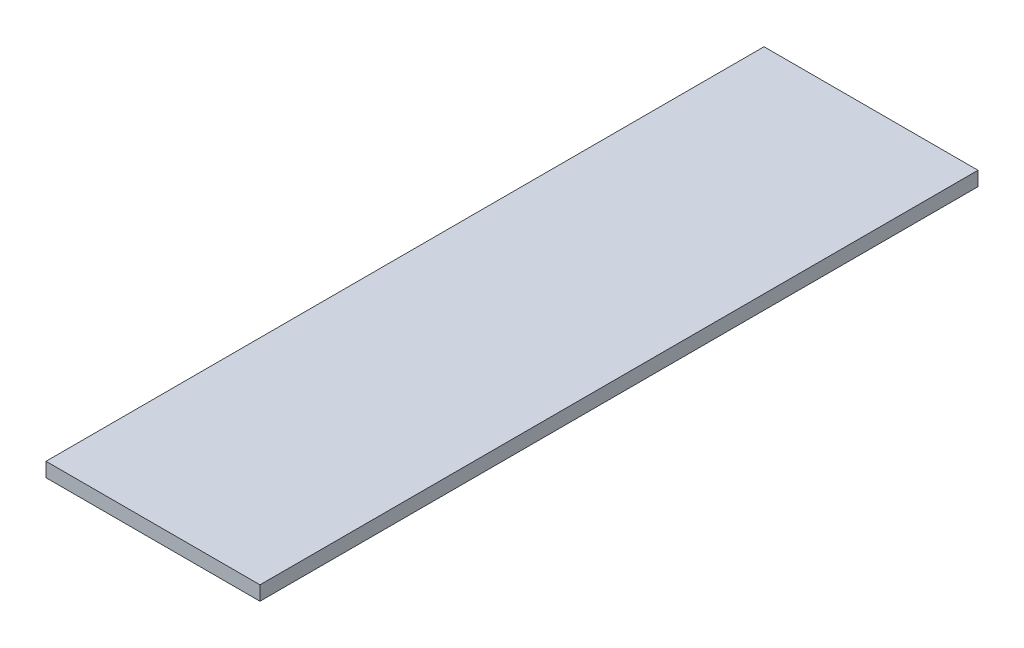
ISO-10303-21;
HEADER;
FILE_DESCRIPTION(('STEP AP214'),'2;1');
FILE_NAME('part.step','',(''),(''),'','','');
FILE_SCHEMA(('AUTOMOTIVE_DESIGN { 1 0 10303 214 1 1 1 1 }'));
ENDSEC;
DATA;
#1=APPLICATION_CONTEXT('core data for automotive mechanical design processes');
#2=APPLICATION_PROTOCOL_DEFINITION('international standard','automotive_design',2000,#1);
#3=PRODUCT_CONTEXT('',#1,'mechanical');
#4=PRODUCT('Part','Part','',(#3));
#5=PRODUCT_RELATED_PRODUCT_CATEGORY('part','',(#4));
#6=PRODUCT_DEFINITION_FORMATION('','',#4);
#7=PRODUCT_DEFINITION_CONTEXT('part definition',#1,'design');
#8=PRODUCT_DEFINITION('design','',#6,#7);
#9=PRODUCT_DEFINITION_SHAPE('','',#8);
#10=(LENGTH_UNIT() NAMED_UNIT(*) SI_UNIT(.MILLI.,.METRE.));
#11=(NAMED_UNIT(*) PLANE_ANGLE_UNIT() SI_UNIT($,.RADIAN.));
#12=(NAMED_UNIT(*) SI_UNIT($,.STERADIAN.) SOLID_ANGLE_UNIT());
#13=UNCERTAINTY_MEASURE_WITH_UNIT(LENGTH_MEASURE(1.E-05),#10,'distance_accuracy_value','');
#14=(GEOMETRIC_REPRESENTATION_CONTEXT(3) GLOBAL_UNCERTAINTY_ASSIGNED_CONTEXT((#13)) GLOBAL_UNIT_ASSIGNED_CONTEXT((#10,
#11,#12)) REPRESENTATION_CONTEXT('',''));
#15=CARTESIAN_POINT('',(0.,0.,0.));
#16=DIRECTION('',(0.,0.,1.));
#17=DIRECTION('',(1.,0.,0.));
#18=AXIS2_PLACEMENT_3D('',#15,#16,#17);
#19=CARTESIAN_POINT('',(225.,-15.,-755.));
#20=DIRECTION('',(0.,0.,1.));
#21=DIRECTION('',(1.,0.,0.));
#22=AXIS2_PLACEMENT_3D('',#19,#20,#21);
#23=PLANE('',#22);
#24=DIRECTION('',(0.,1.,0.));
#25=VECTOR('',#24,1.);
#26=CARTESIAN_POINT('',(-225.,-15.,-755.));
#27=LINE('',#26,#25);
#28=CARTESIAN_POINT('',(-225.,-15.,-755.));
#29=VERTEX_POINT('',#28);
#30=CARTESIAN_POINT('',(-225.,15.,-755.));
#31=VERTEX_POINT('',#30);
#32=EDGE_CURVE('E102',#29,#31,#27,.T.);
#33=ORIENTED_EDGE('',*,*,#32,.T.);
#34=DIRECTION('',(-1.,0.,0.));
#35=VECTOR('',#34,1.);
#36=CARTESIAN_POINT('',(225.,15.,-755.));
#37=LINE('',#36,#35);
#38=CARTESIAN_POINT('',(225.,15.,-755.));
#39=VERTEX_POINT('',#38);
#40=EDGE_CURVE('E11',#39,#31,#37,.T.);
#41=ORIENTED_EDGE('',*,*,#40,.F.);
#42=DIRECTION('',(0.,1.,0.));
#43=VECTOR('',#42,1.);
#44=CARTESIAN_POINT('',(225.,-15.,-755.));
#45=LINE('',#44,#43);
#46=CARTESIAN_POINT('',(225.,-15.,-755.));
#47=VERTEX_POINT('',#46);
#48=EDGE_CURVE('E90',#47,#39,#45,.T.);
#49=ORIENTED_EDGE('',*,*,#48,.F.);
#50=DIRECTION('',(-1.,0.,0.));
#51=VECTOR('',#50,1.);
#52=CARTESIAN_POINT('',(225.,-15.,-755.));
#53=LINE('',#52,#51);
#54=EDGE_CURVE('E98',#47,#29,#53,.T.);
#55=ORIENTED_EDGE('',*,*,#54,.T.);
#56=EDGE_LOOP('',(#33,#41,#49,#55));
#57=FACE_BOUND('',#56,.T.);
#58=ADVANCED_FACE('F39',(#57),#23,.F.);
#59=CARTESIAN_POINT('',(225.,15.,755.));
#60=DIRECTION('',(0.,-1.,0.));
#61=DIRECTION('',(0.,0.,-1.));
#62=AXIS2_PLACEMENT_3D('',#59,#60,#61);
#63=PLANE('',#62);
#64=DIRECTION('',(0.,0.,1.));
#65=VECTOR('',#64,1.);
#66=CARTESIAN_POINT('',(-225.,15.,755.));
#67=LINE('',#66,#65);
#68=CARTESIAN_POINT('',(-225.,15.,755.));
#69=VERTEX_POINT('',#68);
#70=EDGE_CURVE('E94',#31,#69,#67,.T.);
#71=ORIENTED_EDGE('',*,*,#70,.T.);
#72=DIRECTION('',(-1.,0.,0.));
#73=VECTOR('',#72,1.);
#74=CARTESIAN_POINT('',(225.,15.,755.));
#75=LINE('',#74,#73);
#76=CARTESIAN_POINT('',(225.,15.,755.));
#77=VERTEX_POINT('',#76);
#78=EDGE_CURVE('E47',#77,#69,#75,.T.);
#79=ORIENTED_EDGE('',*,*,#78,.F.);
#80=DIRECTION('',(0.,0.,1.));
#81=VECTOR('',#80,1.);
#82=CARTESIAN_POINT('',(225.,15.,755.));
#83=LINE('',#82,#81);
#84=EDGE_CURVE('E85',#39,#77,#83,.T.);
#85=ORIENTED_EDGE('',*,*,#84,.F.);
#86=ORIENTED_EDGE('',*,*,#40,.T.);
#87=EDGE_LOOP('',(#71,#79,#85,#86));
#88=FACE_BOUND('',#87,.T.);
#89=ADVANCED_FACE('F93',(#88),#63,.F.);
#90=CARTESIAN_POINT('',(225.,-15.,755.));
#91=DIRECTION('',(0.,0.,-1.));
#92=DIRECTION('',(-1.,0.,0.));
#93=AXIS2_PLACEMENT_3D('',#90,#91,#92);
#94=PLANE('',#93);
#95=DIRECTION('',(0.,-1.,0.));
#96=VECTOR('',#95,1.);
#97=CARTESIAN_POINT('',(-225.,-15.,755.));
#98=LINE('',#97,#96);
#99=CARTESIAN_POINT('',(-225.,-15.,755.));
#100=VERTEX_POINT('',#99);
#101=EDGE_CURVE('E72',#69,#100,#98,.T.);
#102=ORIENTED_EDGE('',*,*,#101,.T.);
#103=DIRECTION('',(-1.,0.,0.));
#104=VECTOR('',#103,1.);
#105=CARTESIAN_POINT('',(225.,-15.,755.));
#106=LINE('',#105,#104);
#107=CARTESIAN_POINT('',(225.,-15.,755.));
#108=VERTEX_POINT('',#107);
#109=EDGE_CURVE('E95',#108,#100,#106,.T.);
#110=ORIENTED_EDGE('',*,*,#109,.F.);
#111=DIRECTION('',(0.,-1.,0.));
#112=VECTOR('',#111,1.);
#113=CARTESIAN_POINT('',(225.,-15.,755.));
#114=LINE('',#113,#112);
#115=EDGE_CURVE('E88',#77,#108,#114,.T.);
#116=ORIENTED_EDGE('',*,*,#115,.F.);
#117=ORIENTED_EDGE('',*,*,#78,.T.);
#118=EDGE_LOOP('',(#102,#110,#116,#117));
#119=FACE_BOUND('',#118,.T.);
#120=ADVANCED_FACE('F96',(#119),#94,.F.);
#121=CARTESIAN_POINT('',(225.,-15.,755.));
#122=DIRECTION('',(0.,1.,0.));
#123=DIRECTION('',(0.,0.,1.));
#124=AXIS2_PLACEMENT_3D('',#121,#122,#123);
#125=PLANE('',#124);
#126=DIRECTION('',(0.,0.,-1.));
#127=VECTOR('',#126,1.);
#128=CARTESIAN_POINT('',(-225.,-15.,755.));
#129=LINE('',#128,#127);
#130=EDGE_CURVE('E78',#100,#29,#129,.T.);
#131=ORIENTED_EDGE('',*,*,#130,.T.);
#132=ORIENTED_EDGE('',*,*,#54,.F.);
#133=DIRECTION('',(0.,0.,-1.));
#134=VECTOR('',#133,1.);
#135=CARTESIAN_POINT('',(225.,-15.,755.));
#136=LINE('',#135,#134);
#137=EDGE_CURVE('E55',#108,#47,#136,.T.);
#138=ORIENTED_EDGE('',*,*,#137,.F.);
#139=ORIENTED_EDGE('',*,*,#109,.T.);
#140=EDGE_LOOP('',(#131,#132,#138,#139));
#141=FACE_BOUND('',#140,.T.);
#142=ADVANCED_FACE('F109',(#141),#125,.F.);
#143=CARTESIAN_POINT('',(225.,0.,0.));
#144=DIRECTION('',(-1.,0.,0.));
#145=DIRECTION('',(0.,0.,1.));
#146=AXIS2_PLACEMENT_3D('',#143,#144,#145);
#147=PLANE('',#146);
#148=ORIENTED_EDGE('',*,*,#48,.T.);
#149=ORIENTED_EDGE('',*,*,#84,.T.);
#150=ORIENTED_EDGE('',*,*,#115,.T.);
#151=ORIENTED_EDGE('',*,*,#137,.T.);
#152=EDGE_LOOP('',(#148,#149,#150,#151));
#153=FACE_BOUND('',#152,.T.);
#154=ADVANCED_FACE('F86',(#153),#147,.F.);
#155=CARTESIAN_POINT('',(-225.,0.,0.));
#156=DIRECTION('',(-1.,0.,0.));
#157=DIRECTION('',(0.,0.,1.));
#158=AXIS2_PLACEMENT_3D('',#155,#156,#157);
#159=PLANE('',#158);
#160=ORIENTED_EDGE('',*,*,#32,.F.);
#161=ORIENTED_EDGE('',*,*,#130,.F.);
#162=ORIENTED_EDGE('',*,*,#101,.F.);
#163=ORIENTED_EDGE('',*,*,#70,.F.);
#164=EDGE_LOOP('',(#160,#161,#162,#163));
#165=FACE_BOUND('',#164,.T.);
#166=ADVANCED_FACE('F112',(#165),#159,.T.);
#167=CLOSED_SHELL('',(#58,#89,#120,#142,#154,#166));
#168=MANIFOLD_SOLID_BREP('B2',#167);
#169=ADVANCED_BREP_SHAPE_REPRESENTATION('',(#18,#168),#14);
#170=SHAPE_DEFINITION_REPRESENTATION(#9,#169);
ENDSEC;
END-ISO-10303-21;
